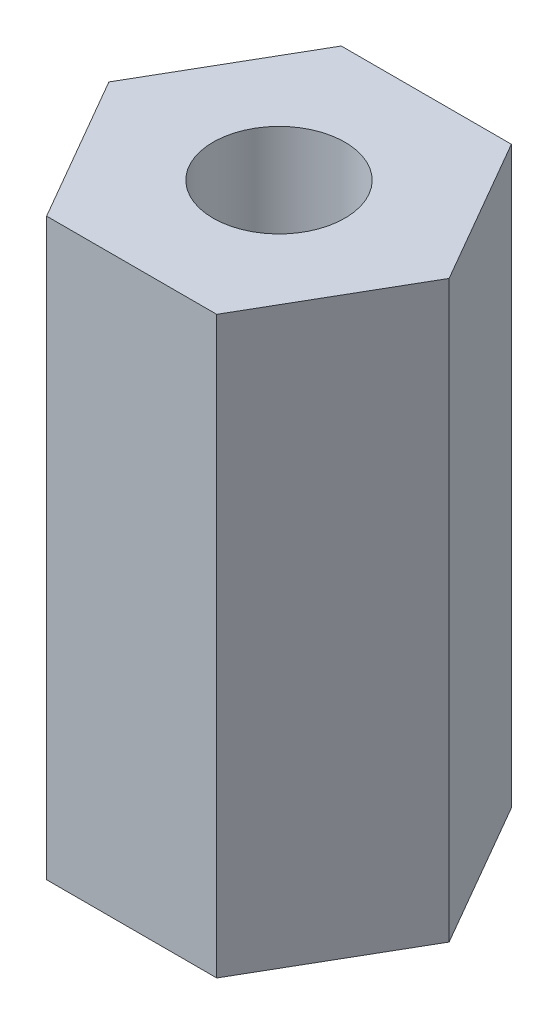
ISO-10303-21;
HEADER;
FILE_DESCRIPTION(('STEP AP214'),'2;1');
FILE_NAME('part.step','',(''),(''),'','','');
FILE_SCHEMA(('AUTOMOTIVE_DESIGN { 1 0 10303 214 1 1 1 1 }'));
ENDSEC;
DATA;
#1=APPLICATION_CONTEXT('core data for automotive mechanical design processes');
#2=APPLICATION_PROTOCOL_DEFINITION('international standard','automotive_design',2000,#1);
#3=PRODUCT_CONTEXT('',#1,'mechanical');
#4=PRODUCT('Part','Part','',(#3));
#5=PRODUCT_RELATED_PRODUCT_CATEGORY('part','',(#4));
#6=PRODUCT_DEFINITION_FORMATION('','',#4);
#7=PRODUCT_DEFINITION_CONTEXT('part definition',#1,'design');
#8=PRODUCT_DEFINITION('design','',#6,#7);
#9=PRODUCT_DEFINITION_SHAPE('','',#8);
#10=(LENGTH_UNIT() NAMED_UNIT(*) SI_UNIT(.MILLI.,.METRE.));
#11=(NAMED_UNIT(*) PLANE_ANGLE_UNIT() SI_UNIT($,.RADIAN.));
#12=(NAMED_UNIT(*) SI_UNIT($,.STERADIAN.) SOLID_ANGLE_UNIT());
#13=UNCERTAINTY_MEASURE_WITH_UNIT(LENGTH_MEASURE(1.E-05),#10,'distance_accuracy_value','');
#14=(GEOMETRIC_REPRESENTATION_CONTEXT(3) GLOBAL_UNCERTAINTY_ASSIGNED_CONTEXT((#13)) GLOBAL_UNIT_ASSIGNED_CONTEXT((#10,
#11,#12)) REPRESENTATION_CONTEXT('',''));
#15=CARTESIAN_POINT('',(0.,0.,0.));
#16=DIRECTION('',(0.,0.,1.));
#17=DIRECTION('',(1.,0.,0.));
#18=AXIS2_PLACEMENT_3D('',#15,#16,#17);
#19=CARTESIAN_POINT('',(1.61311665211585,10.9,2.79399999999998));
#20=DIRECTION('',(-0.866025403784441,0.,-0.499999999999995));
#21=DIRECTION('',(-0.499999999999995,0.,0.866025403784442));
#22=AXIS2_PLACEMENT_3D('',#19,#20,#21);
#23=PLANE('',#22);
#24=DIRECTION('',(0.499999999999995,0.,-0.866025403784441));
#25=VECTOR('',#24,1.);
#26=CARTESIAN_POINT('',(1.61311665211585,0.,2.79399999999998));
#27=LINE('',#26,#25);
#28=CARTESIAN_POINT('',(1.61311665211585,0.,2.79399999999998));
#29=VERTEX_POINT('',#28);
#30=CARTESIAN_POINT('',(3.22623330423163,0.,0.));
#31=VERTEX_POINT('',#30);
#32=EDGE_CURVE('E120',#29,#31,#27,.T.);
#33=ORIENTED_EDGE('',*,*,#32,.T.);
#34=DIRECTION('',(0.,-1.,0.));
#35=VECTOR('',#34,1.);
#36=CARTESIAN_POINT('',(3.22623330423163,10.9,0.));
#37=LINE('',#36,#35);
#38=CARTESIAN_POINT('',(3.22623330423163,10.9,0.));
#39=VERTEX_POINT('',#38);
#40=EDGE_CURVE('E11',#39,#31,#37,.T.);
#41=ORIENTED_EDGE('',*,*,#40,.F.);
#42=DIRECTION('',(0.499999999999995,0.,-0.866025403784441));
#43=VECTOR('',#42,1.);
#44=CARTESIAN_POINT('',(1.61311665211585,10.9,2.79399999999998));
#45=LINE('',#44,#43);
#46=CARTESIAN_POINT('',(1.61311665211585,10.9,2.79399999999998));
#47=VERTEX_POINT('',#46);
#48=EDGE_CURVE('E130',#47,#39,#45,.T.);
#49=ORIENTED_EDGE('',*,*,#48,.F.);
#50=DIRECTION('',(0.,-1.,0.));
#51=VECTOR('',#50,1.);
#52=CARTESIAN_POINT('',(1.61311665211585,10.9,2.79399999999998));
#53=LINE('',#52,#51);
#54=EDGE_CURVE('E116',#47,#29,#53,.T.);
#55=ORIENTED_EDGE('',*,*,#54,.T.);
#56=EDGE_LOOP('',(#33,#41,#49,#55));
#57=FACE_BOUND('',#56,.T.);
#58=ADVANCED_FACE('F35',(#57),#23,.F.);
#59=CARTESIAN_POINT('',(3.22623330423163,10.9,0.));
#60=DIRECTION('',(-0.866025403784438,0.,0.500000000000001));
#61=DIRECTION('',(0.500000000000001,0.,0.866025403784438));
#62=AXIS2_PLACEMENT_3D('',#59,#60,#61);
#63=PLANE('',#62);
#64=DIRECTION('',(-0.500000000000001,0.,-0.866025403784438));
#65=VECTOR('',#64,1.);
#66=CARTESIAN_POINT('',(3.22623330423163,0.,0.));
#67=LINE('',#66,#65);
#68=CARTESIAN_POINT('',(1.61311665211581,0.,-2.79400000000001));
#69=VERTEX_POINT('',#68);
#70=EDGE_CURVE('E123',#31,#69,#67,.T.);
#71=ORIENTED_EDGE('',*,*,#70,.T.);
#72=DIRECTION('',(0.,-1.,0.));
#73=VECTOR('',#72,1.);
#74=CARTESIAN_POINT('',(1.61311665211581,10.9,-2.79400000000001));
#75=LINE('',#74,#73);
#76=CARTESIAN_POINT('',(1.61311665211581,10.9,-2.79400000000001));
#77=VERTEX_POINT('',#76);
#78=EDGE_CURVE('E44',#77,#69,#75,.T.);
#79=ORIENTED_EDGE('',*,*,#78,.F.);
#80=DIRECTION('',(-0.500000000000001,0.,-0.866025403784438));
#81=VECTOR('',#80,1.);
#82=CARTESIAN_POINT('',(3.22623330423163,10.9,0.));
#83=LINE('',#82,#81);
#84=EDGE_CURVE('E89',#39,#77,#83,.T.);
#85=ORIENTED_EDGE('',*,*,#84,.F.);
#86=ORIENTED_EDGE('',*,*,#40,.T.);
#87=EDGE_LOOP('',(#71,#79,#85,#86));
#88=FACE_BOUND('',#87,.T.);
#89=ADVANCED_FACE('F156',(#88),#63,.F.);
#90=CARTESIAN_POINT('',(1.61311665211581,10.9,-2.79400000000001));
#91=DIRECTION('',(0.,0.,1.));
#92=DIRECTION('',(1.,0.,0.));
#93=AXIS2_PLACEMENT_3D('',#90,#91,#92);
#94=PLANE('',#93);
#95=DIRECTION('',(-1.,0.,0.));
#96=VECTOR('',#95,1.);
#97=CARTESIAN_POINT('',(1.61311665211581,0.,-2.79400000000001));
#98=LINE('',#97,#96);
#99=CARTESIAN_POINT('',(-1.61311665211583,0.,-2.79399999999999));
#100=VERTEX_POINT('',#99);
#101=EDGE_CURVE('E125',#69,#100,#98,.T.);
#102=ORIENTED_EDGE('',*,*,#101,.T.);
#103=DIRECTION('',(0.,-1.,0.));
#104=VECTOR('',#103,1.);
#105=CARTESIAN_POINT('',(-1.61311665211583,10.9,-2.79399999999999));
#106=LINE('',#105,#104);
#107=CARTESIAN_POINT('',(-1.61311665211583,10.9,-2.79399999999999));
#108=VERTEX_POINT('',#107);
#109=EDGE_CURVE('E111',#108,#100,#106,.T.);
#110=ORIENTED_EDGE('',*,*,#109,.F.);
#111=DIRECTION('',(-1.,0.,0.));
#112=VECTOR('',#111,1.);
#113=CARTESIAN_POINT('',(1.61311665211581,10.9,-2.79400000000001));
#114=LINE('',#113,#112);
#115=EDGE_CURVE('E102',#77,#108,#114,.T.);
#116=ORIENTED_EDGE('',*,*,#115,.F.);
#117=ORIENTED_EDGE('',*,*,#78,.T.);
#118=EDGE_LOOP('',(#102,#110,#116,#117));
#119=FACE_BOUND('',#118,.T.);
#120=ADVANCED_FACE('F137',(#119),#94,.F.);
#121=CARTESIAN_POINT('',(-1.61311665211583,10.9,-2.79399999999999));
#122=DIRECTION('',(0.866025403784441,0.,0.499999999999995));
#123=DIRECTION('',(0.499999999999995,0.,-0.866025403784442));
#124=AXIS2_PLACEMENT_3D('',#121,#122,#123);
#125=PLANE('',#124);
#126=DIRECTION('',(-0.499999999999995,0.,0.866025403784441));
#127=VECTOR('',#126,1.);
#128=CARTESIAN_POINT('',(-1.61311665211583,0.,-2.79399999999999));
#129=LINE('',#128,#127);
#130=CARTESIAN_POINT('',(-3.22623330423163,0.,0.));
#131=VERTEX_POINT('',#130);
#132=EDGE_CURVE('E110',#100,#131,#129,.T.);
#133=ORIENTED_EDGE('',*,*,#132,.T.);
#134=DIRECTION('',(0.,-1.,0.));
#135=VECTOR('',#134,1.);
#136=CARTESIAN_POINT('',(-3.22623330423163,10.9,0.));
#137=LINE('',#136,#135);
#138=CARTESIAN_POINT('',(-3.22623330423163,10.9,0.));
#139=VERTEX_POINT('',#138);
#140=EDGE_CURVE('E107',#139,#131,#137,.T.);
#141=ORIENTED_EDGE('',*,*,#140,.F.);
#142=DIRECTION('',(-0.499999999999995,0.,0.866025403784441));
#143=VECTOR('',#142,1.);
#144=CARTESIAN_POINT('',(-1.61311665211583,10.9,-2.79399999999999));
#145=LINE('',#144,#143);
#146=EDGE_CURVE('E96',#108,#139,#145,.T.);
#147=ORIENTED_EDGE('',*,*,#146,.F.);
#148=ORIENTED_EDGE('',*,*,#109,.T.);
#149=EDGE_LOOP('',(#133,#141,#147,#148));
#150=FACE_BOUND('',#149,.T.);
#151=ADVANCED_FACE('F108',(#150),#125,.F.);
#152=CARTESIAN_POINT('',(-3.22623330423163,10.9,0.));
#153=DIRECTION('',(0.866025403784434,0.,-0.500000000000007));
#154=DIRECTION('',(-0.500000000000007,0.,-0.866025403784435));
#155=AXIS2_PLACEMENT_3D('',#152,#153,#154);
#156=PLANE('',#155);
#157=DIRECTION('',(0.500000000000007,0.,0.866025403784434));
#158=VECTOR('',#157,1.);
#159=CARTESIAN_POINT('',(-3.22623330423163,0.,0.));
#160=LINE('',#159,#158);
#161=CARTESIAN_POINT('',(-1.61311665211579,0.,2.79400000000002));
#162=VERTEX_POINT('',#161);
#163=EDGE_CURVE('E75',#131,#162,#160,.T.);
#164=ORIENTED_EDGE('',*,*,#163,.T.);
#165=DIRECTION('',(0.,-1.,0.));
#166=VECTOR('',#165,1.);
#167=CARTESIAN_POINT('',(-1.61311665211579,10.9,2.79400000000002));
#168=LINE('',#167,#166);
#169=CARTESIAN_POINT('',(-1.61311665211579,10.9,2.79400000000002));
#170=VERTEX_POINT('',#169);
#171=EDGE_CURVE('E112',#170,#162,#168,.T.);
#172=ORIENTED_EDGE('',*,*,#171,.F.);
#173=DIRECTION('',(0.500000000000007,0.,0.866025403784434));
#174=VECTOR('',#173,1.);
#175=CARTESIAN_POINT('',(-3.22623330423163,10.9,0.));
#176=LINE('',#175,#174);
#177=EDGE_CURVE('E100',#139,#170,#176,.T.);
#178=ORIENTED_EDGE('',*,*,#177,.F.);
#179=ORIENTED_EDGE('',*,*,#140,.T.);
#180=EDGE_LOOP('',(#164,#172,#178,#179));
#181=FACE_BOUND('',#180,.T.);
#182=ADVANCED_FACE('F114',(#181),#156,.F.);
#183=CARTESIAN_POINT('',(-1.61311665211579,10.9,2.79400000000002));
#184=DIRECTION('',(0.,0.,-1.));
#185=DIRECTION('',(-1.,0.,0.));
#186=AXIS2_PLACEMENT_3D('',#183,#184,#185);
#187=PLANE('',#186);
#188=DIRECTION('',(1.,0.,0.));
#189=VECTOR('',#188,1.);
#190=CARTESIAN_POINT('',(-1.61311665211579,0.,2.79400000000002));
#191=LINE('',#190,#189);
#192=EDGE_CURVE('E81',#162,#29,#191,.T.);
#193=ORIENTED_EDGE('',*,*,#192,.T.);
#194=ORIENTED_EDGE('',*,*,#54,.F.);
#195=DIRECTION('',(1.,0.,0.));
#196=VECTOR('',#195,1.);
#197=CARTESIAN_POINT('',(-1.61311665211579,10.9,2.79400000000002));
#198=LINE('',#197,#196);
#199=EDGE_CURVE('E52',#170,#47,#198,.T.);
#200=ORIENTED_EDGE('',*,*,#199,.F.);
#201=ORIENTED_EDGE('',*,*,#171,.T.);
#202=EDGE_LOOP('',(#193,#194,#200,#201));
#203=FACE_BOUND('',#202,.T.);
#204=ADVANCED_FACE('F144',(#203),#187,.F.);
#205=CARTESIAN_POINT('',(0.,10.9,0.));
#206=DIRECTION('',(0.,1.,0.));
#207=DIRECTION('',(0.,0.,1.));
#208=AXIS2_PLACEMENT_3D('',#205,#206,#207);
#209=PLANE('',#208);
#210=CARTESIAN_POINT('',(0.,10.9,0.));
#211=DIRECTION('',(0.,1.,0.));
#212=DIRECTION('',(0.,0.,1.));
#213=AXIS2_PLACEMENT_3D('',#210,#211,#212);
#214=CIRCLE('',#213,1.25);
#215=CARTESIAN_POINT('',(0.,10.9,1.25000000000001));
#216=VERTEX_POINT('',#215);
#217=EDGE_CURVE('E211',#216,#216,#214,.T.);
#218=ORIENTED_EDGE('',*,*,#217,.F.);
#219=EDGE_LOOP('',(#218));
#220=FACE_BOUND('',#219,.T.);
#221=ORIENTED_EDGE('',*,*,#48,.T.);
#222=ORIENTED_EDGE('',*,*,#84,.T.);
#223=ORIENTED_EDGE('',*,*,#115,.T.);
#224=ORIENTED_EDGE('',*,*,#146,.T.);
#225=ORIENTED_EDGE('',*,*,#177,.T.);
#226=ORIENTED_EDGE('',*,*,#199,.T.);
#227=EDGE_LOOP('',(#221,#222,#223,#224,#225,#226));
#228=FACE_BOUND('',#227,.T.);
#229=ADVANCED_FACE('F98',(#220,#228),#209,.T.);
#230=CARTESIAN_POINT('',(0.,0.,0.));
#231=DIRECTION('',(0.,1.,0.));
#232=DIRECTION('',(0.,0.,1.));
#233=AXIS2_PLACEMENT_3D('',#230,#231,#232);
#234=PLANE('',#233);
#235=CARTESIAN_POINT('',(0.,0.,0.));
#236=DIRECTION('',(0.,1.,0.));
#237=DIRECTION('',(0.,0.,1.));
#238=AXIS2_PLACEMENT_3D('',#235,#236,#237);
#239=CIRCLE('',#238,1.25);
#240=CARTESIAN_POINT('',(0.,0.,1.25000000000001));
#241=VERTEX_POINT('',#240);
#242=EDGE_CURVE('E38',#241,#241,#239,.T.);
#243=ORIENTED_EDGE('',*,*,#242,.T.);
#244=EDGE_LOOP('',(#243));
#245=FACE_BOUND('',#244,.T.);
#246=ORIENTED_EDGE('',*,*,#32,.F.);
#247=ORIENTED_EDGE('',*,*,#192,.F.);
#248=ORIENTED_EDGE('',*,*,#163,.F.);
#249=ORIENTED_EDGE('',*,*,#132,.F.);
#250=ORIENTED_EDGE('',*,*,#101,.F.);
#251=ORIENTED_EDGE('',*,*,#70,.F.);
#252=EDGE_LOOP('',(#246,#247,#248,#249,#250,#251));
#253=FACE_BOUND('',#252,.T.);
#254=ADVANCED_FACE('F140',(#245,#253),#234,.F.);
#255=CARTESIAN_POINT('',(0.,10.9,0.));
#256=DIRECTION('',(0.,1.,0.));
#257=DIRECTION('',(0.,0.,1.));
#258=AXIS2_PLACEMENT_3D('',#255,#256,#257);
#259=CYLINDRICAL_SURFACE('',#258,1.25);
#260=ORIENTED_EDGE('',*,*,#217,.T.);
#261=EDGE_LOOP('',(#260));
#262=FACE_BOUND('',#261,.T.);
#263=ORIENTED_EDGE('',*,*,#242,.F.);
#264=EDGE_LOOP('',(#263));
#265=FACE_BOUND('',#264,.T.);
#266=ADVANCED_FACE('F193',(#262,#265),#259,.F.);
#267=CLOSED_SHELL('',(#58,#89,#120,#151,#182,#204,#229,#254,#266));
#268=MANIFOLD_SOLID_BREP('B2',#267);
#269=ADVANCED_BREP_SHAPE_REPRESENTATION('',(#18,#268),#14);
#270=SHAPE_DEFINITION_REPRESENTATION(#9,#269);
ENDSEC;
END-ISO-10303-21;
